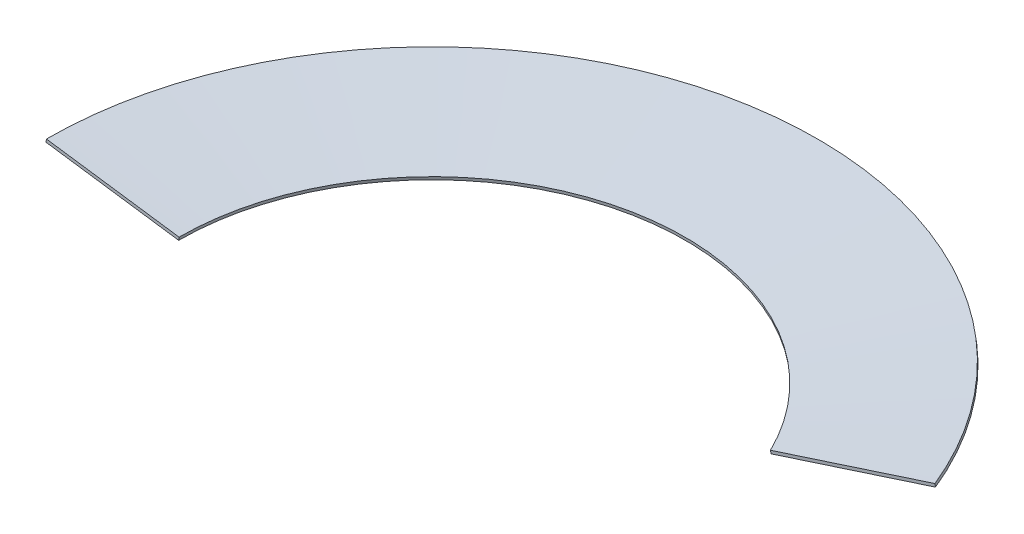
ISO-10303-21;
HEADER;
FILE_DESCRIPTION(('STEP AP214'),'2;1');
FILE_NAME('part.step','',(''),(''),'','','');
FILE_SCHEMA(('AUTOMOTIVE_DESIGN { 1 0 10303 214 1 1 1 1 }'));
ENDSEC;
DATA;
#1=APPLICATION_CONTEXT('core data for automotive mechanical design processes');
#2=APPLICATION_PROTOCOL_DEFINITION('international standard','automotive_design',2000,#1);
#3=PRODUCT_CONTEXT('',#1,'mechanical');
#4=PRODUCT('Part','Part','',(#3));
#5=PRODUCT_RELATED_PRODUCT_CATEGORY('part','',(#4));
#6=PRODUCT_DEFINITION_FORMATION('','',#4);
#7=PRODUCT_DEFINITION_CONTEXT('part definition',#1,'design');
#8=PRODUCT_DEFINITION('design','',#6,#7);
#9=PRODUCT_DEFINITION_SHAPE('','',#8);
#10=(LENGTH_UNIT() NAMED_UNIT(*) SI_UNIT(.MILLI.,.METRE.));
#11=(NAMED_UNIT(*) PLANE_ANGLE_UNIT() SI_UNIT($,.RADIAN.));
#12=(NAMED_UNIT(*) SI_UNIT($,.STERADIAN.) SOLID_ANGLE_UNIT());
#13=UNCERTAINTY_MEASURE_WITH_UNIT(LENGTH_MEASURE(1.E-05),#10,'distance_accuracy_value','');
#14=(GEOMETRIC_REPRESENTATION_CONTEXT(3) GLOBAL_UNCERTAINTY_ASSIGNED_CONTEXT((#13)) GLOBAL_UNIT_ASSIGNED_CONTEXT((#10,
#11,#12)) REPRESENTATION_CONTEXT('',''));
#15=CARTESIAN_POINT('',(0.,0.,0.));
#16=DIRECTION('',(0.,0.,1.));
#17=DIRECTION('',(1.,0.,0.));
#18=AXIS2_PLACEMENT_3D('',#15,#16,#17);
#19=CARTESIAN_POINT('',(0.,2.98053613748315,0.));
#20=DIRECTION('',(0.,-1.,0.));
#21=DIRECTION('',(0.,0.,-1.));
#22=AXIS2_PLACEMENT_3D('',#19,#20,#21);
#23=CONICAL_SURFACE('',#22,83.2216537980799,0.139626340159539);
#24=CARTESIAN_POINT('',(0.,1.99026806874159,0.));
#25=DIRECTION('',(0.,1.,0.));
#26=DIRECTION('',(0.,0.,1.));
#27=AXIS2_PLACEMENT_3D('',#24,#25,#26);
#28=CIRCLE('',#27,83.3608268990399);
#29=CARTESIAN_POINT('',(-83.3608268990399,1.99026806874159,0.));
#30=VERTEX_POINT('',#29);
#31=CARTESIAN_POINT('',(74.8871912308166,1.99026806874158,-36.6187936837193));
#32=VERTEX_POINT('',#31);
#33=EDGE_CURVE('E110',#30,#32,#28,.F.);
#34=ORIENTED_EDGE('',*,*,#33,.T.);
#35=DIRECTION('',(0.125026142535801,-0.990268068741571,-0.0611360426708831));
#36=VECTOR('',#35,1.);
#37=CARTESIAN_POINT('',(74.7621650882809,2.98053613748315,-36.5576576410484));
#38=LINE('',#37,#36);
#39=CARTESIAN_POINT('',(74.7621650882809,2.98053613748315,-36.5576576410484));
#40=VERTEX_POINT('',#39);
#41=EDGE_CURVE('E99',#40,#32,#38,.T.);
#42=ORIENTED_EDGE('',*,*,#41,.F.);
#43=CARTESIAN_POINT('',(0.,2.98053613748315,0.));
#44=DIRECTION('',(0.,-1.,0.));
#45=DIRECTION('',(-1.,0.,0.));
#46=AXIS2_PLACEMENT_3D('',#43,#44,#45);
#47=CIRCLE('',#46,83.2216537980799);
#48=CARTESIAN_POINT('',(-83.2216537980799,2.98053613748315,0.));
#49=VERTEX_POINT('',#48);
#50=EDGE_CURVE('E93',#49,#40,#47,.T.);
#51=ORIENTED_EDGE('',*,*,#50,.F.);
#52=DIRECTION('',(-0.139173100960058,-0.990268068741571,0.));
#53=VECTOR('',#52,1.);
#54=CARTESIAN_POINT('',(-83.2216537980799,2.98053613748315,0.));
#55=LINE('',#54,#53);
#56=EDGE_CURVE('E57',#49,#30,#55,.T.);
#57=ORIENTED_EDGE('',*,*,#56,.T.);
#58=EDGE_LOOP('',(#34,#42,#51,#57));
#59=FACE_BOUND('',#58,.T.);
#60=ADVANCED_FACE('F38',(#59),#23,.F.);
#61=CARTESIAN_POINT('',(0.,8.12335388207234,0.));
#62=DIRECTION('',(0.,1.,0.));
#63=DIRECTION('',(0.,0.,1.));
#64=AXIS2_PLACEMENT_3D('',#61,#62,#63);
#65=CONICAL_SURFACE('',#64,127.,1.43116998663536);
#66=CARTESIAN_POINT('',(117.561821014155,8.12335388207234,-48.0439199049763));
#67=CARTESIAN_POINT('',(116.924008829646,8.03129571502335,-47.8731122516426));
#68=CARTESIAN_POINT('',(116.286194889787,7.93924869783305,-47.7023051410542));
#69=CARTESIAN_POINT('',(113.09711578323,7.47907254541785,-46.8482729252994));
#70=CARTESIAN_POINT('',(110.545822416208,7.1111202138983,-46.1650578374382));
#71=CARTESIAN_POINT('',(106.718825279161,6.55953576017524,-45.1402632411923));
#72=CARTESIAN_POINT('',(105.44315005362,6.37573161637024,-44.7986697153633));
#73=CARTESIAN_POINT('',(101.616092406667,5.82450961472773,-43.7739060278897));
#74=CARTESIAN_POINT('',(99.0646780262483,5.45728218829596,-43.0907527592908));
#75=CARTESIAN_POINT('',(95.2374766419009,4.90691332985878,-42.0660673244286));
#76=CARTESIAN_POINT('',(93.9617295470648,4.72353575756868,-41.7245129247449));
#77=CARTESIAN_POINT('',(91.4102054773883,4.35695812832368,-41.0414204731995));
#78=CARTESIAN_POINT('',(90.1344285025478,4.17375807136887,-40.6998824213376));
#79=CARTESIAN_POINT('',(86.5301897459561,3.65647945141739,-39.7350300533963));
#80=CARTESIAN_POINT('',(84.2016893225901,3.32263113601944,-39.1117365966225));
#81=CARTESIAN_POINT('',(79.544550505115,2.65577430046808,-37.8652148458557));
#82=CARTESIAN_POINT('',(77.2159121109902,2.32276578041048,-37.2419865518701));
#83=CARTESIAN_POINT('',(74.8871912308166,1.99026806874158,-36.6187936837193));
#84=B_SPLINE_CURVE_WITH_KNOTS('',3,(#66,#67,#68,#69,#70,#71,#72,#73,#74,#75,#76,#77,#78,#79,#80,
#81,#82,#83),.UNSPECIFIED.,.F.,.F.,(4,2,2,2,2,2,2,2,4),(0.,2.00002227377815,10.000111391313,
14.0001559423846,22.000245080035,26.0002896348573,30.0003341917168,37.3007979294727,
44.6012625000723),.UNSPECIFIED.);
#85=CARTESIAN_POINT('',(117.561821014155,8.12335388207234,-48.0439199049763));
#86=VERTEX_POINT('',#85);
#87=EDGE_CURVE('E82',#86,#32,#84,.T.);
#88=ORIENTED_EDGE('',*,*,#87,.T.);
#89=ORIENTED_EDGE('',*,*,#33,.F.);
#90=DIRECTION('',(-0.990268068741571,0.139173100960058,0.));
#91=VECTOR('',#90,1.);
#92=CARTESIAN_POINT('',(-127.,8.12335388207234,0.));
#93=LINE('',#92,#91);
#94=CARTESIAN_POINT('',(-127.,8.12335388207234,0.));
#95=VERTEX_POINT('',#94);
#96=EDGE_CURVE('E97',#95,#30,#93,.F.);
#97=ORIENTED_EDGE('',*,*,#96,.F.);
#98=CARTESIAN_POINT('',(0.,8.12335388207234,0.));
#99=DIRECTION('',(0.,1.,0.));
#100=DIRECTION('',(0.,0.,1.));
#101=AXIS2_PLACEMENT_3D('',#98,#99,#100);
#102=CIRCLE('',#101,127.);
#103=EDGE_CURVE('E108',#95,#86,#102,.F.);
#104=ORIENTED_EDGE('',*,*,#103,.T.);
#105=EDGE_LOOP('',(#88,#89,#97,#104));
#106=FACE_BOUND('',#105,.T.);
#107=ADVANCED_FACE('F129',(#106),#65,.T.);
#108=CARTESIAN_POINT('',(0.,9.11362195081391,0.));
#109=DIRECTION('',(0.,1.,0.));
#110=DIRECTION('',(0.,0.,1.));
#111=AXIS2_PLACEMENT_3D('',#108,#109,#110);
#112=CONICAL_SURFACE('',#111,126.86082689904,1.43116998663536);
#113=ORIENTED_EDGE('',*,*,#50,.T.);
#114=CARTESIAN_POINT('',(117.433190752855,9.113650819263,-47.9913245080789));
#115=CARTESIAN_POINT('',(113.87753957069,8.60043740244842,-47.0385906452509));
#116=CARTESIAN_POINT('',(110.321845580807,8.08754139839916,-46.0858453121296));
#117=CARTESIAN_POINT('',(103.210333658296,7.06267460147074,-44.1803214355285));
#118=CARTESIAN_POINT('',(99.6545157256834,6.55070380847695,-43.2275428920528));
#119=CARTESIAN_POINT('',(92.5427164605796,5.52797765620852,-41.321942022236));
#120=CARTESIAN_POINT('',(88.986735128077,5.01722229701886,-40.3691196958917));
#121=CARTESIAN_POINT('',(83.6525923966338,4.25236369706914,-38.9398404586892));
#122=CARTESIAN_POINT('',(81.8745162538459,3.99762322114501,-38.4634063921481));
#123=CARTESIAN_POINT('',(78.3182952044036,3.48865693586965,-37.5105198338435));
#124=CARTESIAN_POINT('',(76.5401502977477,3.23443112653068,-37.0340673420795));
#125=CARTESIAN_POINT('',(74.7619650882808,2.98050757804684,-36.5576040512099));
#126=B_SPLINE_CURVE_WITH_KNOTS('',3,(#114,#115,#116,#117,#118,#119,#120,#121,#122,#123,#124,
#125),.UNSPECIFIED.,.F.,.F.,(4,2,2,2,2,4),(0.,11.1500541752867,22.3001069688928,
33.4501605421186,39.0251880196963,44.6002156299954),.UNSPECIFIED.);
#127=CARTESIAN_POINT('',(117.432990752855,9.11362195081391,-47.9912709182404));
#128=VERTEX_POINT('',#127);
#129=EDGE_CURVE('E78',#128,#40,#126,.T.);
#130=ORIENTED_EDGE('',*,*,#129,.F.);
#131=CARTESIAN_POINT('',(0.,9.11362195081391,0.));
#132=DIRECTION('',(0.,-1.,0.));
#133=DIRECTION('',(-1.,0.,0.));
#134=AXIS2_PLACEMENT_3D('',#131,#132,#133);
#135=CIRCLE('',#134,126.86082689904);
#136=CARTESIAN_POINT('',(-126.86082689904,9.11362195081391,0.));
#137=VERTEX_POINT('',#136);
#138=EDGE_CURVE('E92',#137,#128,#135,.T.);
#139=ORIENTED_EDGE('',*,*,#138,.F.);
#140=DIRECTION('',(0.990268068741571,-0.139173100960058,0.));
#141=VECTOR('',#140,1.);
#142=CARTESIAN_POINT('',(-126.86082689904,9.11362195081391,0.));
#143=LINE('',#142,#141);
#144=EDGE_CURVE('E96',#137,#49,#143,.T.);
#145=ORIENTED_EDGE('',*,*,#144,.T.);
#146=EDGE_LOOP('',(#113,#130,#139,#145));
#147=FACE_BOUND('',#146,.T.);
#148=ADVANCED_FACE('F91',(#147),#112,.F.);
#149=CARTESIAN_POINT('',(0.,9.11362195081391,0.));
#150=DIRECTION('',(0.,-1.,0.));
#151=DIRECTION('',(0.,0.,-1.));
#152=AXIS2_PLACEMENT_3D('',#149,#150,#151);
#153=CONICAL_SURFACE('',#152,126.86082689904,0.139626340159539);
#154=DIRECTION('',(-0.139173100960058,-0.990268068741571,0.));
#155=VECTOR('',#154,1.);
#156=CARTESIAN_POINT('',(-126.86082689904,9.11362195081391,0.));
#157=LINE('',#156,#155);
#158=EDGE_CURVE('E11',#137,#95,#157,.T.);
#159=ORIENTED_EDGE('',*,*,#158,.F.);
#160=ORIENTED_EDGE('',*,*,#138,.T.);
#161=DIRECTION('',(0.128830261299616,-0.990268068741571,-0.0526489867358442));
#162=VECTOR('',#161,1.);
#163=CARTESIAN_POINT('',(117.432990752855,9.11362195081391,-47.9912709182404));
#164=LINE('',#163,#162);
#165=EDGE_CURVE('E48',#128,#86,#164,.T.);
#166=ORIENTED_EDGE('',*,*,#165,.T.);
#167=ORIENTED_EDGE('',*,*,#103,.F.);
#168=EDGE_LOOP('',(#159,#160,#166,#167));
#169=FACE_BOUND('',#168,.T.);
#170=ADVANCED_FACE('F95',(#169),#153,.T.);
#171=CARTESIAN_POINT('',(-126.86082689904,9.11362195081391,0.));
#172=DIRECTION('',(0.,0.,-1.));
#173=DIRECTION('',(0.990268068741571,-0.139173100960058,0.));
#174=AXIS2_PLACEMENT_3D('',#171,#172,#173);
#175=PLANE('',#174);
#176=ORIENTED_EDGE('',*,*,#144,.F.);
#177=ORIENTED_EDGE('',*,*,#158,.T.);
#178=ORIENTED_EDGE('',*,*,#96,.T.);
#179=ORIENTED_EDGE('',*,*,#56,.F.);
#180=EDGE_LOOP('',(#176,#177,#178,#179));
#181=FACE_BOUND('',#180,.T.);
#182=ADVANCED_FACE('F40',(#181),#175,.F.);
#183=CARTESIAN_POINT('',(117.432990752855,9.11362195081391,-47.9912709182404));
#184=CARTESIAN_POINT('',(103.210529401935,7.06071997033568,-44.1803738848784));
#185=CARTESIAN_POINT('',(88.9875177642809,5.01187650101866,-40.3693294026305));
#186=CARTESIAN_POINT('',(74.7621650882808,2.98053613748315,-36.5576576410484));
#187=CARTESIAN_POINT('',(117.561821014155,8.12335388207234,-48.0439199049763));
#188=CARTESIAN_POINT('',(103.338575993149,6.07044976630186,-44.2349003229447));
#189=CARTESIAN_POINT('',(89.1145970054031,4.02160529422378,-40.4262159306263));
#190=CARTESIAN_POINT('',(74.8871912308166,1.99026806874158,-36.6187936837193));
#191=B_SPLINE_SURFACE_WITH_KNOTS('',1,3,((#183,#184,#185,#186),(#187,#188,#189,#190)),
.UNSPECIFIED.,.F.,.F.,.F.,(2,2),(4,4),(0.,1.),(2.09057990621164E-07,0.0446000029707721),.UNSPECIFIED.);
#192=ORIENTED_EDGE('',*,*,#129,.T.);
#193=ORIENTED_EDGE('',*,*,#41,.T.);
#194=ORIENTED_EDGE('',*,*,#87,.F.);
#195=ORIENTED_EDGE('',*,*,#165,.F.);
#196=EDGE_LOOP('',(#192,#193,#194,#195));
#197=FACE_BOUND('',#196,.T.);
#198=ADVANCED_FACE('F75',(#197),#191,.F.);
#199=CLOSED_SHELL('',(#60,#107,#148,#170,#182,#198));
#200=MANIFOLD_SOLID_BREP('B2',#199);
#201=ADVANCED_BREP_SHAPE_REPRESENTATION('',(#18,#200),#14);
#202=SHAPE_DEFINITION_REPRESENTATION(#9,#201);
ENDSEC;
END-ISO-10303-21;
